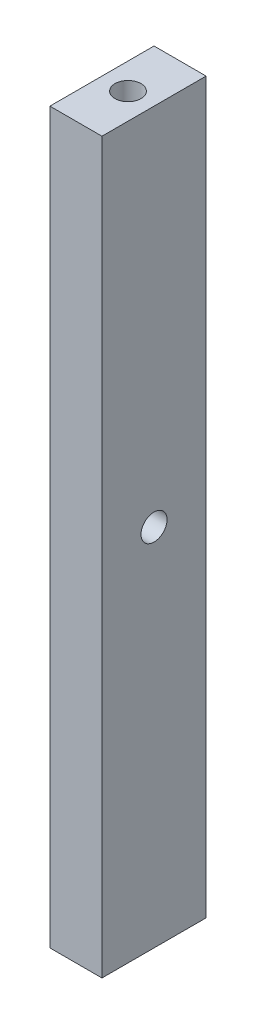
ISO-10303-21;
HEADER;
FILE_DESCRIPTION(('STEP AP214'),'2;1');
FILE_NAME('part.step','',(''),(''),'','','');
FILE_SCHEMA(('AUTOMOTIVE_DESIGN { 1 0 10303 214 1 1 1 1 }'));
ENDSEC;
DATA;
#1=APPLICATION_CONTEXT('core data for automotive mechanical design processes');
#2=APPLICATION_PROTOCOL_DEFINITION('international standard','automotive_design',2000,#1);
#3=PRODUCT_CONTEXT('',#1,'mechanical');
#4=PRODUCT('Part','Part','',(#3));
#5=PRODUCT_RELATED_PRODUCT_CATEGORY('part','',(#4));
#6=PRODUCT_DEFINITION_FORMATION('','',#4);
#7=PRODUCT_DEFINITION_CONTEXT('part definition',#1,'design');
#8=PRODUCT_DEFINITION('design','',#6,#7);
#9=PRODUCT_DEFINITION_SHAPE('','',#8);
#10=(LENGTH_UNIT() NAMED_UNIT(*) SI_UNIT(.MILLI.,.METRE.));
#11=(NAMED_UNIT(*) PLANE_ANGLE_UNIT() SI_UNIT($,.RADIAN.));
#12=(NAMED_UNIT(*) SI_UNIT($,.STERADIAN.) SOLID_ANGLE_UNIT());
#13=UNCERTAINTY_MEASURE_WITH_UNIT(LENGTH_MEASURE(1.E-05),#10,'distance_accuracy_value','');
#14=(GEOMETRIC_REPRESENTATION_CONTEXT(3) GLOBAL_UNCERTAINTY_ASSIGNED_CONTEXT((#13)) GLOBAL_UNIT_ASSIGNED_CONTEXT((#10,
#11,#12)) REPRESENTATION_CONTEXT('',''));
#15=CARTESIAN_POINT('',(0.,0.,0.));
#16=DIRECTION('',(0.,0.,1.));
#17=DIRECTION('',(1.,0.,0.));
#18=AXIS2_PLACEMENT_3D('',#15,#16,#17);
#19=CARTESIAN_POINT('',(0.,-711.2,0.));
#20=DIRECTION('',(-1.,0.,0.));
#21=DIRECTION('',(0.,0.,1.));
#22=AXIS2_PLACEMENT_3D('',#19,#20,#21);
#23=PLANE('',#22);
#24=CARTESIAN_POINT('',(0.,-355.6,50.8));
#25=DIRECTION('',(-1.,0.,0.));
#26=DIRECTION('',(0.,0.,1.));
#27=AXIS2_PLACEMENT_3D('',#24,#25,#26);
#28=CIRCLE('',#27,12.7);
#29=CARTESIAN_POINT('',(0.,-355.6,63.5));
#30=VERTEX_POINT('',#29);
#31=EDGE_CURVE('E167',#30,#30,#28,.T.);
#32=ORIENTED_EDGE('',*,*,#31,.F.);
#33=EDGE_LOOP('',(#32));
#34=FACE_BOUND('',#33,.T.);
#35=DIRECTION('',(0.,0.,1.));
#36=VECTOR('',#35,1.);
#37=CARTESIAN_POINT('',(0.,0.,0.));
#38=LINE('',#37,#36);
#39=CARTESIAN_POINT('',(0.,0.,0.));
#40=VERTEX_POINT('',#39);
#41=CARTESIAN_POINT('',(0.,0.,101.6));
#42=VERTEX_POINT('',#41);
#43=EDGE_CURVE('E99',#40,#42,#38,.T.);
#44=ORIENTED_EDGE('',*,*,#43,.F.);
#45=DIRECTION('',(0.,1.,0.));
#46=VECTOR('',#45,1.);
#47=CARTESIAN_POINT('',(0.,-711.2,0.));
#48=LINE('',#47,#46);
#49=CARTESIAN_POINT('',(0.,-711.2,0.));
#50=VERTEX_POINT('',#49);
#51=EDGE_CURVE('E11',#50,#40,#48,.T.);
#52=ORIENTED_EDGE('',*,*,#51,.F.);
#53=DIRECTION('',(0.,0.,1.));
#54=VECTOR('',#53,1.);
#55=CARTESIAN_POINT('',(0.,-711.2,0.));
#56=LINE('',#55,#54);
#57=CARTESIAN_POINT('',(0.,-711.2,101.6));
#58=VERTEX_POINT('',#57);
#59=EDGE_CURVE('E92',#50,#58,#56,.T.);
#60=ORIENTED_EDGE('',*,*,#59,.T.);
#61=DIRECTION('',(0.,1.,0.));
#62=VECTOR('',#61,1.);
#63=CARTESIAN_POINT('',(0.,-711.2,101.6));
#64=LINE('',#63,#62);
#65=EDGE_CURVE('E37',#58,#42,#64,.T.);
#66=ORIENTED_EDGE('',*,*,#65,.T.);
#67=EDGE_LOOP('',(#44,#52,#60,#66));
#68=FACE_BOUND('',#67,.T.);
#69=ADVANCED_FACE('F34',(#34,#68),#23,.T.);
#70=CARTESIAN_POINT('',(0.,-711.2,0.));
#71=DIRECTION('',(0.,0.,-1.));
#72=DIRECTION('',(-1.,0.,0.));
#73=AXIS2_PLACEMENT_3D('',#70,#71,#72);
#74=PLANE('',#73);
#75=DIRECTION('',(-1.,0.,0.));
#76=VECTOR('',#75,1.);
#77=CARTESIAN_POINT('',(0.,0.,0.));
#78=LINE('',#77,#76);
#79=CARTESIAN_POINT('',(50.8,0.,0.));
#80=VERTEX_POINT('',#79);
#81=EDGE_CURVE('E94',#80,#40,#78,.T.);
#82=ORIENTED_EDGE('',*,*,#81,.F.);
#83=DIRECTION('',(0.,1.,0.));
#84=VECTOR('',#83,1.);
#85=CARTESIAN_POINT('',(50.8,-711.2,0.));
#86=LINE('',#85,#84);
#87=CARTESIAN_POINT('',(50.8,-711.2,0.));
#88=VERTEX_POINT('',#87);
#89=EDGE_CURVE('E43',#88,#80,#86,.T.);
#90=ORIENTED_EDGE('',*,*,#89,.F.);
#91=DIRECTION('',(-1.,0.,0.));
#92=VECTOR('',#91,1.);
#93=CARTESIAN_POINT('',(0.,-711.2,0.));
#94=LINE('',#93,#92);
#95=EDGE_CURVE('E89',#88,#50,#94,.T.);
#96=ORIENTED_EDGE('',*,*,#95,.T.);
#97=ORIENTED_EDGE('',*,*,#51,.T.);
#98=EDGE_LOOP('',(#82,#90,#96,#97));
#99=FACE_BOUND('',#98,.T.);
#100=ADVANCED_FACE('F110',(#99),#74,.T.);
#101=CARTESIAN_POINT('',(50.8,-711.2,0.));
#102=DIRECTION('',(1.,0.,0.));
#103=DIRECTION('',(0.,0.,-1.));
#104=AXIS2_PLACEMENT_3D('',#101,#102,#103);
#105=PLANE('',#104);
#106=CARTESIAN_POINT('',(50.8,-355.6,50.8));
#107=DIRECTION('',(1.,0.,0.));
#108=DIRECTION('',(0.,0.,-1.));
#109=AXIS2_PLACEMENT_3D('',#106,#107,#108);
#110=CIRCLE('',#109,12.7);
#111=CARTESIAN_POINT('',(50.8,-355.6,63.5));
#112=VERTEX_POINT('',#111);
#113=EDGE_CURVE('E103',#112,#112,#110,.F.);
#114=ORIENTED_EDGE('',*,*,#113,.T.);
#115=EDGE_LOOP('',(#114));
#116=FACE_BOUND('',#115,.T.);
#117=DIRECTION('',(0.,0.,-1.));
#118=VECTOR('',#117,1.);
#119=CARTESIAN_POINT('',(50.8,0.,0.));
#120=LINE('',#119,#118);
#121=CARTESIAN_POINT('',(50.8,0.,101.6));
#122=VERTEX_POINT('',#121);
#123=EDGE_CURVE('E84',#122,#80,#120,.T.);
#124=ORIENTED_EDGE('',*,*,#123,.F.);
#125=DIRECTION('',(0.,1.,0.));
#126=VECTOR('',#125,1.);
#127=CARTESIAN_POINT('',(50.8,-711.2,101.6));
#128=LINE('',#127,#126);
#129=CARTESIAN_POINT('',(50.8,-711.2,101.6));
#130=VERTEX_POINT('',#129);
#131=EDGE_CURVE('E79',#130,#122,#128,.T.);
#132=ORIENTED_EDGE('',*,*,#131,.F.);
#133=DIRECTION('',(0.,0.,-1.));
#134=VECTOR('',#133,1.);
#135=CARTESIAN_POINT('',(50.8,-711.2,0.));
#136=LINE('',#135,#134);
#137=EDGE_CURVE('E82',#130,#88,#136,.T.);
#138=ORIENTED_EDGE('',*,*,#137,.T.);
#139=ORIENTED_EDGE('',*,*,#89,.T.);
#140=EDGE_LOOP('',(#124,#132,#138,#139));
#141=FACE_BOUND('',#140,.T.);
#142=ADVANCED_FACE('F81',(#116,#141),#105,.T.);
#143=CARTESIAN_POINT('',(0.,-711.2,101.6));
#144=DIRECTION('',(0.,0.,1.));
#145=DIRECTION('',(1.,0.,0.));
#146=AXIS2_PLACEMENT_3D('',#143,#144,#145);
#147=PLANE('',#146);
#148=DIRECTION('',(1.,0.,0.));
#149=VECTOR('',#148,1.);
#150=CARTESIAN_POINT('',(0.,0.,101.6));
#151=LINE('',#150,#149);
#152=EDGE_CURVE('E102',#42,#122,#151,.T.);
#153=ORIENTED_EDGE('',*,*,#152,.F.);
#154=ORIENTED_EDGE('',*,*,#65,.F.);
#155=DIRECTION('',(1.,0.,0.));
#156=VECTOR('',#155,1.);
#157=CARTESIAN_POINT('',(0.,-711.2,101.6));
#158=LINE('',#157,#156);
#159=EDGE_CURVE('E88',#58,#130,#158,.T.);
#160=ORIENTED_EDGE('',*,*,#159,.T.);
#161=ORIENTED_EDGE('',*,*,#131,.T.);
#162=EDGE_LOOP('',(#153,#154,#160,#161));
#163=FACE_BOUND('',#162,.T.);
#164=ADVANCED_FACE('F91',(#163),#147,.T.);
#165=CARTESIAN_POINT('',(0.,-711.2,0.));
#166=DIRECTION('',(0.,1.,0.));
#167=DIRECTION('',(0.,0.,1.));
#168=AXIS2_PLACEMENT_3D('',#165,#166,#167);
#169=PLANE('',#168);
#170=CARTESIAN_POINT('',(25.4,-711.2,50.8));
#171=DIRECTION('',(0.,-1.,0.));
#172=DIRECTION('',(0.,0.,-1.));
#173=AXIS2_PLACEMENT_3D('',#170,#171,#172);
#174=CIRCLE('',#173,12.7);
#175=CARTESIAN_POINT('',(25.4,-711.2,38.1));
#176=VERTEX_POINT('',#175);
#177=EDGE_CURVE('E158',#176,#176,#174,.T.);
#178=ORIENTED_EDGE('',*,*,#177,.F.);
#179=EDGE_LOOP('',(#178));
#180=FACE_BOUND('',#179,.T.);
#181=ORIENTED_EDGE('',*,*,#59,.F.);
#182=ORIENTED_EDGE('',*,*,#95,.F.);
#183=ORIENTED_EDGE('',*,*,#137,.F.);
#184=ORIENTED_EDGE('',*,*,#159,.F.);
#185=EDGE_LOOP('',(#181,#182,#183,#184));
#186=FACE_BOUND('',#185,.T.);
#187=ADVANCED_FACE('F87',(#180,#186),#169,.F.);
#188=CARTESIAN_POINT('',(0.,0.,0.));
#189=DIRECTION('',(0.,1.,0.));
#190=DIRECTION('',(0.,0.,1.));
#191=AXIS2_PLACEMENT_3D('',#188,#189,#190);
#192=PLANE('',#191);
#193=CARTESIAN_POINT('',(25.4,0.,50.8));
#194=DIRECTION('',(0.,1.,0.));
#195=DIRECTION('',(0.,0.,1.));
#196=AXIS2_PLACEMENT_3D('',#193,#194,#195);
#197=CIRCLE('',#196,12.7);
#198=CARTESIAN_POINT('',(25.4,0.,63.5));
#199=VERTEX_POINT('',#198);
#200=EDGE_CURVE('E157',#199,#199,#197,.T.);
#201=ORIENTED_EDGE('',*,*,#200,.F.);
#202=EDGE_LOOP('',(#201));
#203=FACE_BOUND('',#202,.T.);
#204=ORIENTED_EDGE('',*,*,#43,.T.);
#205=ORIENTED_EDGE('',*,*,#152,.T.);
#206=ORIENTED_EDGE('',*,*,#123,.T.);
#207=ORIENTED_EDGE('',*,*,#81,.T.);
#208=EDGE_LOOP('',(#204,#205,#206,#207));
#209=FACE_BOUND('',#208,.T.);
#210=ADVANCED_FACE('F109',(#203,#209),#192,.T.);
#211=CARTESIAN_POINT('',(86.7210244842766,-355.6,50.8));
#212=DIRECTION('',(-1.,0.,0.));
#213=DIRECTION('',(0.,0.,1.));
#214=AXIS2_PLACEMENT_3D('',#211,#212,#213);
#215=CYLINDRICAL_SURFACE('',#214,12.7);
#216=CARTESIAN_POINT('',(0.,-355.6,63.5));
#217=CARTESIAN_POINT('',(0.529166666666669,-355.6,63.5));
#218=CARTESIAN_POINT('',(1.05833333333334,-355.6,63.5));
#219=CARTESIAN_POINT('',(2.11666666666667,-355.6,63.5));
#220=CARTESIAN_POINT('',(2.64583333333333,-355.6,63.5));
#221=CARTESIAN_POINT('',(3.70416666666667,-355.6,63.5));
#222=CARTESIAN_POINT('',(4.23333333333333,-355.6,63.5));
#223=CARTESIAN_POINT('',(5.29166666666667,-355.6,63.5));
#224=CARTESIAN_POINT('',(5.82083333333333,-355.6,63.5));
#225=CARTESIAN_POINT('',(6.87916666666666,-355.6,63.5));
#226=CARTESIAN_POINT('',(7.40833333333333,-355.6,63.5));
#227=CARTESIAN_POINT('',(8.46666666666667,-355.6,63.5));
#228=CARTESIAN_POINT('',(8.99583333333334,-355.6,63.5));
#229=CARTESIAN_POINT('',(10.0541666666667,-355.6,63.5));
#230=CARTESIAN_POINT('',(10.5833333333333,-355.6,63.5));
#231=CARTESIAN_POINT('',(11.6416666666667,-355.6,63.5));
#232=CARTESIAN_POINT('',(12.1708333333333,-355.6,63.5));
#233=CARTESIAN_POINT('',(13.2291666666667,-355.6,63.5));
#234=CARTESIAN_POINT('',(13.7583333333333,-355.6,63.5));
#235=CARTESIAN_POINT('',(14.8166666666667,-355.6,63.5));
#236=CARTESIAN_POINT('',(15.3458333333333,-355.6,63.5));
#237=CARTESIAN_POINT('',(16.4041666666667,-355.6,63.5));
#238=CARTESIAN_POINT('',(16.9333333333333,-355.6,63.5));
#239=CARTESIAN_POINT('',(17.9916666666667,-355.6,63.5));
#240=CARTESIAN_POINT('',(18.5208333333333,-355.6,63.5));
#241=CARTESIAN_POINT('',(19.5791666666667,-355.6,63.5));
#242=CARTESIAN_POINT('',(20.1083333333333,-355.6,63.5));
#243=CARTESIAN_POINT('',(21.1666666666667,-355.6,63.5));
#244=CARTESIAN_POINT('',(21.6958333333333,-355.6,63.5));
#245=CARTESIAN_POINT('',(22.7541666666667,-355.6,63.5));
#246=CARTESIAN_POINT('',(23.2833333333333,-355.6,63.5));
#247=CARTESIAN_POINT('',(24.3416666666667,-355.6,63.5));
#248=CARTESIAN_POINT('',(24.8708333333333,-355.6,63.5));
#249=CARTESIAN_POINT('',(25.9291666666667,-355.6,63.5));
#250=CARTESIAN_POINT('',(26.4583333333333,-355.6,63.5));
#251=CARTESIAN_POINT('',(27.5166666666667,-355.6,63.5));
#252=CARTESIAN_POINT('',(28.0458333333333,-355.6,63.5));
#253=CARTESIAN_POINT('',(29.1041666666667,-355.6,63.5));
#254=CARTESIAN_POINT('',(29.6333333333333,-355.6,63.5));
#255=CARTESIAN_POINT('',(30.6916666666667,-355.6,63.5));
#256=CARTESIAN_POINT('',(31.2208333333333,-355.6,63.5));
#257=CARTESIAN_POINT('',(32.2791666666667,-355.6,63.5));
#258=CARTESIAN_POINT('',(32.8083333333333,-355.6,63.5));
#259=CARTESIAN_POINT('',(33.8666666666667,-355.6,63.5));
#260=CARTESIAN_POINT('',(34.3958333333333,-355.6,63.5));
#261=CARTESIAN_POINT('',(35.4541666666667,-355.6,63.5));
#262=CARTESIAN_POINT('',(35.9833333333333,-355.6,63.5));
#263=CARTESIAN_POINT('',(37.0416666666667,-355.6,63.5));
#264=CARTESIAN_POINT('',(37.5708333333333,-355.6,63.5));
#265=CARTESIAN_POINT('',(38.6291666666667,-355.6,63.5));
#266=CARTESIAN_POINT('',(39.1583333333333,-355.6,63.5));
#267=CARTESIAN_POINT('',(40.2166666666667,-355.6,63.5));
#268=CARTESIAN_POINT('',(40.7458333333333,-355.6,63.5));
#269=CARTESIAN_POINT('',(41.8041666666667,-355.6,63.5));
#270=CARTESIAN_POINT('',(42.3333333333333,-355.6,63.5));
#271=CARTESIAN_POINT('',(43.3916666666667,-355.6,63.5));
#272=CARTESIAN_POINT('',(43.9208333333333,-355.6,63.5));
#273=CARTESIAN_POINT('',(44.9791666666667,-355.6,63.5));
#274=CARTESIAN_POINT('',(45.5083333333333,-355.6,63.5));
#275=CARTESIAN_POINT('',(46.5666666666667,-355.6,63.5));
#276=CARTESIAN_POINT('',(47.0958333333333,-355.6,63.5));
#277=CARTESIAN_POINT('',(48.1541666666667,-355.6,63.5));
#278=CARTESIAN_POINT('',(48.6833333333333,-355.6,63.5));
#279=CARTESIAN_POINT('',(49.7416666666667,-355.6,63.5));
#280=CARTESIAN_POINT('',(50.2708333333333,-355.6,63.5));
#281=CARTESIAN_POINT('',(50.8,-355.6,63.5));
#282=B_SPLINE_CURVE_WITH_KNOTS('',3,(#216,#217,#218,#219,#220,#221,#222,#223,#224,#225,#226,
#227,#228,#229,#230,#231,#232,#233,#234,#235,#236,#237,#238,#239,#240,#241,#242,#243,#244,#245,
#246,#247,#248,#249,#250,#251,#252,#253,#254,#255,#256,#257,#258,#259,#260,#261,#262,#263,#264,
#265,#266,#267,#268,#269,#270,#271,#272,#273,#274,#275,#276,#277,#278,#279,#280,#281),
.UNSPECIFIED.,.F.,.F.,(4,2,2,2,2,2,2,2,2,2,2,2,2,2,2,2,2,2,2,2,2,2,2,2,2,2,2,2,2,2,2,2,4),(0.,
1.58750000000001,3.175,4.7625,6.34999999999999,7.9375,9.52500000000001,11.1125,12.7,14.2875,
15.875,17.4625,19.05,20.6375,22.225,23.8125,25.4,26.9875,28.575,30.1625,31.75,33.3375,34.925,
36.5125,38.1,39.6875,41.275,42.8625,44.45,46.0375,47.625,49.2125,50.8),.UNSPECIFIED.);
#283=EDGE_CURVE('BSEAM130',#30,#112,#282,.T.);
#284=ORIENTED_EDGE('',*,*,#31,.T.);
#285=ORIENTED_EDGE('',*,*,#113,.F.);
#286=ORIENTED_EDGE('',*,*,#283,.T.);
#287=ORIENTED_EDGE('',*,*,#283,.F.);
#288=EDGE_LOOP('',(#284,#286,#285,#287));
#289=FACE_BOUND('',#288,.T.);
#290=ADVANCED_FACE('F130',(#289),#215,.F.);
#291=CARTESIAN_POINT('',(25.4,-152.4,50.8));
#292=DIRECTION('',(0.,1.,0.));
#293=DIRECTION('',(0.,0.,1.));
#294=AXIS2_PLACEMENT_3D('',#291,#292,#293);
#295=CYLINDRICAL_SURFACE('',#294,12.7);
#296=CARTESIAN_POINT('',(25.4,-152.4,50.8));
#297=DIRECTION('',(0.,1.,0.));
#298=DIRECTION('',(0.,0.,1.));
#299=AXIS2_PLACEMENT_3D('',#296,#297,#298);
#300=CIRCLE('',#299,12.7);
#301=CARTESIAN_POINT('',(25.4,-152.4,63.5));
#302=VERTEX_POINT('',#301);
#303=EDGE_CURVE('E161',#302,#302,#300,.T.);
#304=CARTESIAN_POINT('',(25.4,-152.4,63.5));
#305=CARTESIAN_POINT('',(25.4,-150.8125,63.5));
#306=CARTESIAN_POINT('',(25.4,-149.225,63.5));
#307=CARTESIAN_POINT('',(25.4,-146.05,63.5));
#308=CARTESIAN_POINT('',(25.4,-144.4625,63.5));
#309=CARTESIAN_POINT('',(25.4,-141.2875,63.5));
#310=CARTESIAN_POINT('',(25.4,-139.7,63.5));
#311=CARTESIAN_POINT('',(25.4,-136.525,63.5));
#312=CARTESIAN_POINT('',(25.4,-134.9375,63.5));
#313=CARTESIAN_POINT('',(25.4,-131.7625,63.5));
#314=CARTESIAN_POINT('',(25.4,-130.175,63.5));
#315=CARTESIAN_POINT('',(25.4,-127.,63.5));
#316=CARTESIAN_POINT('',(25.4,-125.4125,63.5));
#317=CARTESIAN_POINT('',(25.4,-122.2375,63.5));
#318=CARTESIAN_POINT('',(25.4,-120.65,63.5));
#319=CARTESIAN_POINT('',(25.4,-117.475,63.5));
#320=CARTESIAN_POINT('',(25.4,-115.8875,63.5));
#321=CARTESIAN_POINT('',(25.4,-112.7125,63.5));
#322=CARTESIAN_POINT('',(25.4,-111.125,63.5));
#323=CARTESIAN_POINT('',(25.4,-107.95,63.5));
#324=CARTESIAN_POINT('',(25.4,-106.3625,63.5));
#325=CARTESIAN_POINT('',(25.4,-103.1875,63.5));
#326=CARTESIAN_POINT('',(25.4,-101.6,63.5));
#327=CARTESIAN_POINT('',(25.4,-98.425,63.5));
#328=CARTESIAN_POINT('',(25.4,-96.8375,63.5));
#329=CARTESIAN_POINT('',(25.4,-93.6625,63.5));
#330=CARTESIAN_POINT('',(25.4,-92.075,63.5));
#331=CARTESIAN_POINT('',(25.4,-88.9,63.5));
#332=CARTESIAN_POINT('',(25.4,-87.3125,63.5));
#333=CARTESIAN_POINT('',(25.4,-84.1375,63.5));
#334=CARTESIAN_POINT('',(25.4,-82.55,63.5));
#335=CARTESIAN_POINT('',(25.4,-79.375,63.5));
#336=CARTESIAN_POINT('',(25.4,-77.7875,63.5));
#337=CARTESIAN_POINT('',(25.4,-74.6125,63.5));
#338=CARTESIAN_POINT('',(25.4,-73.025,63.5));
#339=CARTESIAN_POINT('',(25.4,-69.85,63.5));
#340=CARTESIAN_POINT('',(25.4,-68.2625,63.5));
#341=CARTESIAN_POINT('',(25.4,-65.0875,63.5));
#342=CARTESIAN_POINT('',(25.4,-63.5,63.5));
#343=CARTESIAN_POINT('',(25.4,-60.325,63.5));
#344=CARTESIAN_POINT('',(25.4,-58.7375,63.5));
#345=CARTESIAN_POINT('',(25.4,-55.5625,63.5));
#346=CARTESIAN_POINT('',(25.4,-53.975,63.5));
#347=CARTESIAN_POINT('',(25.4,-50.8,63.5));
#348=CARTESIAN_POINT('',(25.4,-49.2125,63.5));
#349=CARTESIAN_POINT('',(25.4,-46.0375,63.5));
#350=CARTESIAN_POINT('',(25.4,-44.45,63.5));
#351=CARTESIAN_POINT('',(25.4,-41.275,63.5));
#352=CARTESIAN_POINT('',(25.4,-39.6875,63.5));
#353=CARTESIAN_POINT('',(25.4,-36.5125,63.5));
#354=CARTESIAN_POINT('',(25.4,-34.925,63.5));
#355=CARTESIAN_POINT('',(25.4,-31.75,63.5));
#356=CARTESIAN_POINT('',(25.4,-30.1625,63.5));
#357=CARTESIAN_POINT('',(25.4,-26.9875,63.5));
#358=CARTESIAN_POINT('',(25.4,-25.4,63.5));
#359=CARTESIAN_POINT('',(25.4,-22.225,63.5));
#360=CARTESIAN_POINT('',(25.4,-20.6375,63.5));
#361=CARTESIAN_POINT('',(25.4,-17.4625,63.5));
#362=CARTESIAN_POINT('',(25.4,-15.875,63.5));
#363=CARTESIAN_POINT('',(25.4,-12.7,63.5));
#364=CARTESIAN_POINT('',(25.4,-11.1125,63.5));
#365=CARTESIAN_POINT('',(25.4,-7.93750000000001,63.5));
#366=CARTESIAN_POINT('',(25.4,-6.35,63.5));
#367=CARTESIAN_POINT('',(25.4,-3.175,63.5));
#368=CARTESIAN_POINT('',(25.4,-1.5875,63.5));
#369=CARTESIAN_POINT('',(25.4,0.,63.5));
#370=B_SPLINE_CURVE_WITH_KNOTS('',3,(#304,#305,#306,#307,#308,#309,#310,#311,#312,#313,#314,
#315,#316,#317,#318,#319,#320,#321,#322,#323,#324,#325,#326,#327,#328,#329,#330,#331,#332,#333,
#334,#335,#336,#337,#338,#339,#340,#341,#342,#343,#344,#345,#346,#347,#348,#349,#350,#351,#352,
#353,#354,#355,#356,#357,#358,#359,#360,#361,#362,#363,#364,#365,#366,#367,#368,#369),
.UNSPECIFIED.,.F.,.F.,(4,2,2,2,2,2,2,2,2,2,2,2,2,2,2,2,2,2,2,2,2,2,2,2,2,2,2,2,2,2,2,2,4),(0.,
4.7625,9.52500000000001,14.2875,19.05,23.8125,28.575,33.3375,38.1,42.8625,47.625,52.3875,57.15,
61.9125,66.675,71.4375,76.2,80.9625,85.725,90.4875,95.25,100.0125,104.775,109.5375,114.3,
119.0625,123.825,128.5875,133.35,138.1125,142.875,147.6375,152.4),.UNSPECIFIED.);
#371=EDGE_CURVE('BSEAM136',#302,#199,#370,.T.);
#372=ORIENTED_EDGE('',*,*,#303,.F.);
#373=ORIENTED_EDGE('',*,*,#200,.T.);
#374=ORIENTED_EDGE('',*,*,#371,.T.);
#375=ORIENTED_EDGE('',*,*,#371,.F.);
#376=EDGE_LOOP('',(#372,#374,#373,#375));
#377=FACE_BOUND('',#376,.T.);
#378=ADVANCED_FACE('F136',(#377),#295,.F.);
#379=CARTESIAN_POINT('',(25.4,-152.4,50.8));
#380=DIRECTION('',(0.,1.,0.));
#381=DIRECTION('',(0.,0.,1.));
#382=AXIS2_PLACEMENT_3D('',#379,#380,#381);
#383=PLANE('',#382);
#384=ORIENTED_EDGE('',*,*,#303,.T.);
#385=EDGE_LOOP('',(#384));
#386=FACE_BOUND('',#385,.T.);
#387=ADVANCED_FACE('F140',(#386),#383,.T.);
#388=CARTESIAN_POINT('',(25.4,-558.8,50.8));
#389=DIRECTION('',(0.,-1.,0.));
#390=DIRECTION('',(0.,0.,-1.));
#391=AXIS2_PLACEMENT_3D('',#388,#389,#390);
#392=CYLINDRICAL_SURFACE('',#391,12.7);
#393=CARTESIAN_POINT('',(25.4,-558.8,50.8));
#394=DIRECTION('',(0.,-1.,0.));
#395=DIRECTION('',(0.,0.,-1.));
#396=AXIS2_PLACEMENT_3D('',#393,#394,#395);
#397=CIRCLE('',#396,12.7);
#398=CARTESIAN_POINT('',(25.4,-558.8,38.1));
#399=VERTEX_POINT('',#398);
#400=EDGE_CURVE('E156',#399,#399,#397,.T.);
#401=CARTESIAN_POINT('',(25.4,-558.8,38.1));
#402=CARTESIAN_POINT('',(25.4,-560.3875,38.1));
#403=CARTESIAN_POINT('',(25.4,-561.975,38.1));
#404=CARTESIAN_POINT('',(25.4,-565.15,38.1));
#405=CARTESIAN_POINT('',(25.4,-566.7375,38.1));
#406=CARTESIAN_POINT('',(25.4,-569.9125,38.1));
#407=CARTESIAN_POINT('',(25.4,-571.5,38.1));
#408=CARTESIAN_POINT('',(25.4,-574.675,38.1));
#409=CARTESIAN_POINT('',(25.4,-576.2625,38.1));
#410=CARTESIAN_POINT('',(25.4,-579.4375,38.1));
#411=CARTESIAN_POINT('',(25.4,-581.025,38.1));
#412=CARTESIAN_POINT('',(25.4,-584.2,38.1));
#413=CARTESIAN_POINT('',(25.4,-585.7875,38.1));
#414=CARTESIAN_POINT('',(25.4,-588.9625,38.1));
#415=CARTESIAN_POINT('',(25.4,-590.55,38.1));
#416=CARTESIAN_POINT('',(25.4,-593.725,38.1));
#417=CARTESIAN_POINT('',(25.4,-595.3125,38.1));
#418=CARTESIAN_POINT('',(25.4,-598.4875,38.1));
#419=CARTESIAN_POINT('',(25.4,-600.075,38.1));
#420=CARTESIAN_POINT('',(25.4,-603.25,38.1));
#421=CARTESIAN_POINT('',(25.4,-604.8375,38.1));
#422=CARTESIAN_POINT('',(25.4,-608.0125,38.1));
#423=CARTESIAN_POINT('',(25.4,-609.6,38.1));
#424=CARTESIAN_POINT('',(25.4,-612.775,38.1));
#425=CARTESIAN_POINT('',(25.4,-614.3625,38.1));
#426=CARTESIAN_POINT('',(25.4,-617.5375,38.1));
#427=CARTESIAN_POINT('',(25.4,-619.125,38.1));
#428=CARTESIAN_POINT('',(25.4,-622.3,38.1));
#429=CARTESIAN_POINT('',(25.4,-623.8875,38.1));
#430=CARTESIAN_POINT('',(25.4,-627.0625,38.1));
#431=CARTESIAN_POINT('',(25.4,-628.65,38.1));
#432=CARTESIAN_POINT('',(25.4,-631.825,38.1));
#433=CARTESIAN_POINT('',(25.4,-633.4125,38.1));
#434=CARTESIAN_POINT('',(25.4,-636.5875,38.1));
#435=CARTESIAN_POINT('',(25.4,-638.175,38.1));
#436=CARTESIAN_POINT('',(25.4,-641.35,38.1));
#437=CARTESIAN_POINT('',(25.4,-642.9375,38.1));
#438=CARTESIAN_POINT('',(25.4,-646.1125,38.1));
#439=CARTESIAN_POINT('',(25.4,-647.7,38.1));
#440=CARTESIAN_POINT('',(25.4,-650.875,38.1));
#441=CARTESIAN_POINT('',(25.4,-652.4625,38.1));
#442=CARTESIAN_POINT('',(25.4,-655.6375,38.1));
#443=CARTESIAN_POINT('',(25.4,-657.225,38.1));
#444=CARTESIAN_POINT('',(25.4,-660.4,38.1));
#445=CARTESIAN_POINT('',(25.4,-661.9875,38.1));
#446=CARTESIAN_POINT('',(25.4,-665.1625,38.1));
#447=CARTESIAN_POINT('',(25.4,-666.75,38.1));
#448=CARTESIAN_POINT('',(25.4,-669.925,38.1));
#449=CARTESIAN_POINT('',(25.4,-671.5125,38.1));
#450=CARTESIAN_POINT('',(25.4,-674.6875,38.1));
#451=CARTESIAN_POINT('',(25.4,-676.275,38.1));
#452=CARTESIAN_POINT('',(25.4,-679.45,38.1));
#453=CARTESIAN_POINT('',(25.4,-681.0375,38.1));
#454=CARTESIAN_POINT('',(25.4,-684.2125,38.1));
#455=CARTESIAN_POINT('',(25.4,-685.8,38.1));
#456=CARTESIAN_POINT('',(25.4,-688.975,38.1));
#457=CARTESIAN_POINT('',(25.4,-690.5625,38.1));
#458=CARTESIAN_POINT('',(25.4,-693.7375,38.1));
#459=CARTESIAN_POINT('',(25.4,-695.325,38.1));
#460=CARTESIAN_POINT('',(25.4,-698.5,38.1));
#461=CARTESIAN_POINT('',(25.4,-700.0875,38.1));
#462=CARTESIAN_POINT('',(25.4,-703.2625,38.1));
#463=CARTESIAN_POINT('',(25.4,-704.85,38.1));
#464=CARTESIAN_POINT('',(25.4,-708.025,38.1));
#465=CARTESIAN_POINT('',(25.4,-709.6125,38.1));
#466=CARTESIAN_POINT('',(25.4,-711.2,38.1));
#467=B_SPLINE_CURVE_WITH_KNOTS('',3,(#401,#402,#403,#404,#405,#406,#407,#408,#409,#410,#411,
#412,#413,#414,#415,#416,#417,#418,#419,#420,#421,#422,#423,#424,#425,#426,#427,#428,#429,#430,
#431,#432,#433,#434,#435,#436,#437,#438,#439,#440,#441,#442,#443,#444,#445,#446,#447,#448,#449,
#450,#451,#452,#453,#454,#455,#456,#457,#458,#459,#460,#461,#462,#463,#464,#465,#466),
.UNSPECIFIED.,.F.,.F.,(4,2,2,2,2,2,2,2,2,2,2,2,2,2,2,2,2,2,2,2,2,2,2,2,2,2,2,2,2,2,2,2,4),(0.,
4.76249999999989,9.5249999999999,14.2874999999999,19.0499999999999,23.8124999999999,
28.5749999999999,33.3374999999999,38.0999999999999,42.8624999999999,47.6249999999999,
52.3874999999999,57.1499999999999,61.9124999999999,66.6749999999999,71.4374999999999,
76.1999999999999,80.9624999999999,85.7249999999999,90.4874999999999,95.2499999999999,100.0125,
104.775,109.5375,114.3,119.0625,123.825,128.5875,133.35,138.1125,142.875,147.6375,152.4),.UNSPECIFIED.);
#468=EDGE_CURVE('BSEAM144',#399,#176,#467,.T.);
#469=ORIENTED_EDGE('',*,*,#400,.F.);
#470=ORIENTED_EDGE('',*,*,#177,.T.);
#471=ORIENTED_EDGE('',*,*,#468,.T.);
#472=ORIENTED_EDGE('',*,*,#468,.F.);
#473=EDGE_LOOP('',(#469,#471,#470,#472));
#474=FACE_BOUND('',#473,.T.);
#475=ADVANCED_FACE('F144',(#474),#392,.F.);
#476=CARTESIAN_POINT('',(25.4,-558.8,50.8));
#477=DIRECTION('',(0.,-1.,0.));
#478=DIRECTION('',(0.,0.,-1.));
#479=AXIS2_PLACEMENT_3D('',#476,#477,#478);
#480=PLANE('',#479);
#481=ORIENTED_EDGE('',*,*,#400,.T.);
#482=EDGE_LOOP('',(#481));
#483=FACE_BOUND('',#482,.T.);
#484=ADVANCED_FACE('F148',(#483),#480,.T.);
#485=CLOSED_SHELL('',(#69,#100,#142,#164,#187,#210,#290,#378,#387,#475,#484));
#486=MANIFOLD_SOLID_BREP('B2',#485);
#487=ADVANCED_BREP_SHAPE_REPRESENTATION('',(#18,#486),#14);
#488=SHAPE_DEFINITION_REPRESENTATION(#9,#487);
ENDSEC;
END-ISO-10303-21;
